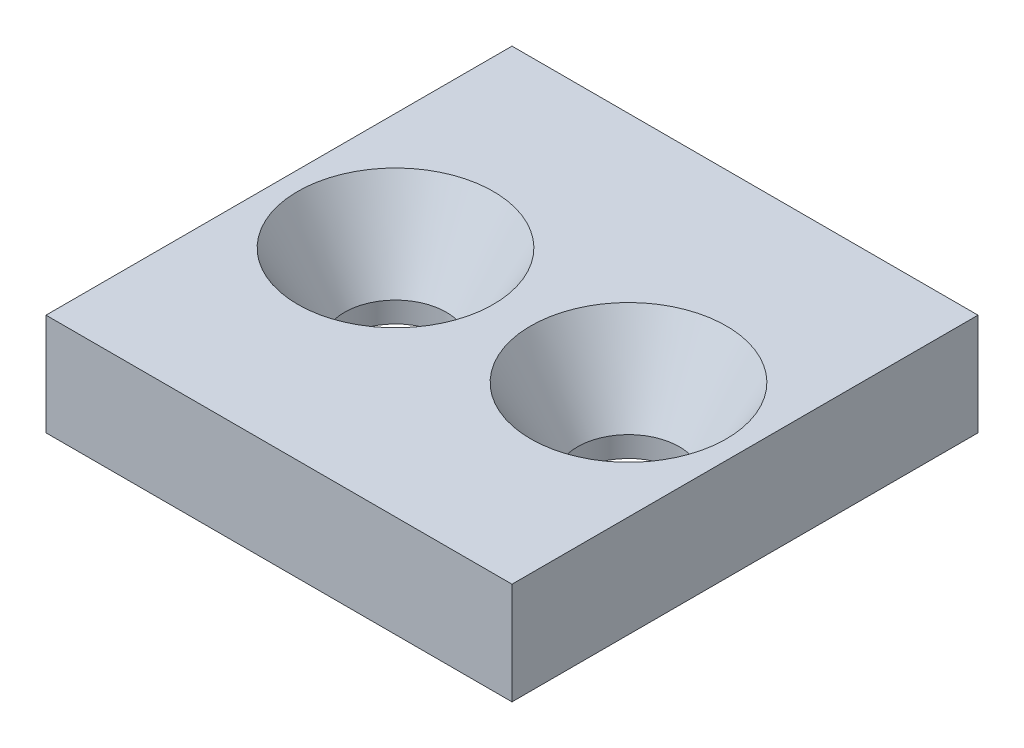
ISO-10303-21;
HEADER;
FILE_DESCRIPTION(('STEP AP214'),'2;1');
FILE_NAME('part.step','',(''),(''),'','','');
FILE_SCHEMA(('AUTOMOTIVE_DESIGN { 1 0 10303 214 1 1 1 1 }'));
ENDSEC;
DATA;
#1=APPLICATION_CONTEXT('core data for automotive mechanical design processes');
#2=APPLICATION_PROTOCOL_DEFINITION('international standard','automotive_design',2000,#1);
#3=PRODUCT_CONTEXT('',#1,'mechanical');
#4=PRODUCT('Part','Part','',(#3));
#5=PRODUCT_RELATED_PRODUCT_CATEGORY('part','',(#4));
#6=PRODUCT_DEFINITION_FORMATION('','',#4);
#7=PRODUCT_DEFINITION_CONTEXT('part definition',#1,'design');
#8=PRODUCT_DEFINITION('design','',#6,#7);
#9=PRODUCT_DEFINITION_SHAPE('','',#8);
#10=(LENGTH_UNIT() NAMED_UNIT(*) SI_UNIT(.MILLI.,.METRE.));
#11=(NAMED_UNIT(*) PLANE_ANGLE_UNIT() SI_UNIT($,.RADIAN.));
#12=(NAMED_UNIT(*) SI_UNIT($,.STERADIAN.) SOLID_ANGLE_UNIT());
#13=UNCERTAINTY_MEASURE_WITH_UNIT(LENGTH_MEASURE(1.E-05),#10,'distance_accuracy_value','');
#14=(GEOMETRIC_REPRESENTATION_CONTEXT(3) GLOBAL_UNCERTAINTY_ASSIGNED_CONTEXT((#13)) GLOBAL_UNIT_ASSIGNED_CONTEXT((#10,
#11,#12)) REPRESENTATION_CONTEXT('',''));
#15=CARTESIAN_POINT('',(0.,0.,0.));
#16=DIRECTION('',(0.,0.,1.));
#17=DIRECTION('',(1.,0.,0.));
#18=AXIS2_PLACEMENT_3D('',#15,#16,#17);
#19=CARTESIAN_POINT('',(0.,0.,0.));
#20=DIRECTION('',(0.,-1.,0.));
#21=DIRECTION('',(0.,0.,-1.));
#22=AXIS2_PLACEMENT_3D('',#19,#20,#21);
#23=PLANE('',#22);
#24=CARTESIAN_POINT('',(8.,0.,-16.));
#25=DIRECTION('',(0.,1.,0.));
#26=DIRECTION('',(0.,0.,1.));
#27=AXIS2_PLACEMENT_3D('',#24,#25,#26);
#28=CIRCLE('',#27,3.5);
#29=CARTESIAN_POINT('',(8.,0.,-12.5));
#30=VERTEX_POINT('',#29);
#31=EDGE_CURVE('E123',#30,#30,#28,.T.);
#32=ORIENTED_EDGE('',*,*,#31,.T.);
#33=EDGE_LOOP('',(#32));
#34=FACE_BOUND('',#33,.T.);
#35=DIRECTION('',(1.,0.,0.));
#36=VECTOR('',#35,1.);
#37=CARTESIAN_POINT('',(0.,0.,0.));
#38=LINE('',#37,#36);
#39=CARTESIAN_POINT('',(0.,0.,0.));
#40=VERTEX_POINT('',#39);
#41=CARTESIAN_POINT('',(32.,0.,0.));
#42=VERTEX_POINT('',#41);
#43=EDGE_CURVE('E101',#40,#42,#38,.T.);
#44=ORIENTED_EDGE('',*,*,#43,.F.);
#45=DIRECTION('',(0.,0.,1.));
#46=VECTOR('',#45,1.);
#47=CARTESIAN_POINT('',(0.,0.,0.));
#48=LINE('',#47,#46);
#49=CARTESIAN_POINT('',(0.,0.,-32.));
#50=VERTEX_POINT('',#49);
#51=EDGE_CURVE('E77',#50,#40,#48,.T.);
#52=ORIENTED_EDGE('',*,*,#51,.F.);
#53=DIRECTION('',(-1.,0.,0.));
#54=VECTOR('',#53,1.);
#55=CARTESIAN_POINT('',(0.,0.,-32.));
#56=LINE('',#55,#54);
#57=CARTESIAN_POINT('',(32.,0.,-32.));
#58=VERTEX_POINT('',#57);
#59=EDGE_CURVE('E71',#58,#50,#56,.T.);
#60=ORIENTED_EDGE('',*,*,#59,.F.);
#61=DIRECTION('',(0.,0.,-1.));
#62=VECTOR('',#61,1.);
#63=CARTESIAN_POINT('',(32.,0.,-32.));
#64=LINE('',#63,#62);
#65=EDGE_CURVE('E93',#42,#58,#64,.T.);
#66=ORIENTED_EDGE('',*,*,#65,.F.);
#67=EDGE_LOOP('',(#44,#52,#60,#66));
#68=FACE_BOUND('',#67,.T.);
#69=CARTESIAN_POINT('',(24.,0.,-16.));
#70=DIRECTION('',(0.,1.,0.));
#71=DIRECTION('',(0.,0.,1.));
#72=AXIS2_PLACEMENT_3D('',#69,#70,#71);
#73=CIRCLE('',#72,3.5);
#74=CARTESIAN_POINT('',(24.,0.,-12.5));
#75=VERTEX_POINT('',#74);
#76=EDGE_CURVE('E104',#75,#75,#73,.T.);
#77=ORIENTED_EDGE('',*,*,#76,.T.);
#78=EDGE_LOOP('',(#77));
#79=FACE_BOUND('',#78,.T.);
#80=ADVANCED_FACE('F37',(#34,#68,#79),#23,.T.);
#81=CARTESIAN_POINT('',(0.,7.,0.));
#82=DIRECTION('',(0.,0.,-1.));
#83=DIRECTION('',(-1.,0.,0.));
#84=AXIS2_PLACEMENT_3D('',#81,#82,#83);
#85=PLANE('',#84);
#86=ORIENTED_EDGE('',*,*,#43,.T.);
#87=DIRECTION('',(0.,-1.,0.));
#88=VECTOR('',#87,1.);
#89=CARTESIAN_POINT('',(32.,7.,0.));
#90=LINE('',#89,#88);
#91=CARTESIAN_POINT('',(32.,7.,0.));
#92=VERTEX_POINT('',#91);
#93=EDGE_CURVE('E11',#92,#42,#90,.T.);
#94=ORIENTED_EDGE('',*,*,#93,.F.);
#95=DIRECTION('',(1.,0.,0.));
#96=VECTOR('',#95,1.);
#97=CARTESIAN_POINT('',(0.,7.,0.));
#98=LINE('',#97,#96);
#99=CARTESIAN_POINT('',(0.,7.,0.));
#100=VERTEX_POINT('',#99);
#101=EDGE_CURVE('E89',#100,#92,#98,.T.);
#102=ORIENTED_EDGE('',*,*,#101,.F.);
#103=DIRECTION('',(0.,-1.,0.));
#104=VECTOR('',#103,1.);
#105=CARTESIAN_POINT('',(0.,7.,0.));
#106=LINE('',#105,#104);
#107=EDGE_CURVE('E97',#100,#40,#106,.T.);
#108=ORIENTED_EDGE('',*,*,#107,.T.);
#109=EDGE_LOOP('',(#86,#94,#102,#108));
#110=FACE_BOUND('',#109,.T.);
#111=ADVANCED_FACE('F39',(#110),#85,.F.);
#112=CARTESIAN_POINT('',(32.,7.,-32.));
#113=DIRECTION('',(-1.,0.,0.));
#114=DIRECTION('',(0.,0.,1.));
#115=AXIS2_PLACEMENT_3D('',#112,#113,#114);
#116=PLANE('',#115);
#117=ORIENTED_EDGE('',*,*,#65,.T.);
#118=DIRECTION('',(0.,-1.,0.));
#119=VECTOR('',#118,1.);
#120=CARTESIAN_POINT('',(32.,7.,-32.));
#121=LINE('',#120,#119);
#122=CARTESIAN_POINT('',(32.,7.,-32.));
#123=VERTEX_POINT('',#122);
#124=EDGE_CURVE('E46',#123,#58,#121,.T.);
#125=ORIENTED_EDGE('',*,*,#124,.F.);
#126=DIRECTION('',(0.,0.,-1.));
#127=VECTOR('',#126,1.);
#128=CARTESIAN_POINT('',(32.,7.,-32.));
#129=LINE('',#128,#127);
#130=EDGE_CURVE('E84',#92,#123,#129,.T.);
#131=ORIENTED_EDGE('',*,*,#130,.F.);
#132=ORIENTED_EDGE('',*,*,#93,.T.);
#133=EDGE_LOOP('',(#117,#125,#131,#132));
#134=FACE_BOUND('',#133,.T.);
#135=ADVANCED_FACE('F92',(#134),#116,.F.);
#136=CARTESIAN_POINT('',(0.,7.,-32.));
#137=DIRECTION('',(0.,0.,1.));
#138=DIRECTION('',(1.,0.,0.));
#139=AXIS2_PLACEMENT_3D('',#136,#137,#138);
#140=PLANE('',#139);
#141=ORIENTED_EDGE('',*,*,#59,.T.);
#142=DIRECTION('',(0.,-1.,0.));
#143=VECTOR('',#142,1.);
#144=CARTESIAN_POINT('',(0.,7.,-32.));
#145=LINE('',#144,#143);
#146=CARTESIAN_POINT('',(0.,7.,-32.));
#147=VERTEX_POINT('',#146);
#148=EDGE_CURVE('E94',#147,#50,#145,.T.);
#149=ORIENTED_EDGE('',*,*,#148,.F.);
#150=DIRECTION('',(-1.,0.,0.));
#151=VECTOR('',#150,1.);
#152=CARTESIAN_POINT('',(0.,7.,-32.));
#153=LINE('',#152,#151);
#154=EDGE_CURVE('E87',#123,#147,#153,.T.);
#155=ORIENTED_EDGE('',*,*,#154,.F.);
#156=ORIENTED_EDGE('',*,*,#124,.T.);
#157=EDGE_LOOP('',(#141,#149,#155,#156));
#158=FACE_BOUND('',#157,.T.);
#159=ADVANCED_FACE('F95',(#158),#140,.F.);
#160=CARTESIAN_POINT('',(0.,7.,0.));
#161=DIRECTION('',(1.,0.,0.));
#162=DIRECTION('',(0.,0.,-1.));
#163=AXIS2_PLACEMENT_3D('',#160,#161,#162);
#164=PLANE('',#163);
#165=ORIENTED_EDGE('',*,*,#51,.T.);
#166=ORIENTED_EDGE('',*,*,#107,.F.);
#167=DIRECTION('',(0.,0.,1.));
#168=VECTOR('',#167,1.);
#169=CARTESIAN_POINT('',(0.,7.,0.));
#170=LINE('',#169,#168);
#171=EDGE_CURVE('E54',#147,#100,#170,.T.);
#172=ORIENTED_EDGE('',*,*,#171,.F.);
#173=ORIENTED_EDGE('',*,*,#148,.T.);
#174=EDGE_LOOP('',(#165,#166,#172,#173));
#175=FACE_BOUND('',#174,.T.);
#176=ADVANCED_FACE('F109',(#175),#164,.F.);
#177=CARTESIAN_POINT('',(0.,7.,0.));
#178=DIRECTION('',(0.,-1.,0.));
#179=DIRECTION('',(0.,0.,-1.));
#180=AXIS2_PLACEMENT_3D('',#177,#178,#179);
#181=PLANE('',#180);
#182=CARTESIAN_POINT('',(8.,7.,-16.));
#183=DIRECTION('',(0.,1.,0.));
#184=DIRECTION('',(0.,0.,1.));
#185=AXIS2_PLACEMENT_3D('',#182,#183,#184);
#186=CIRCLE('',#185,6.72);
#187=CARTESIAN_POINT('',(8.,7.,-9.28));
#188=VERTEX_POINT('',#187);
#189=EDGE_CURVE('E129',#188,#188,#186,.T.);
#190=ORIENTED_EDGE('',*,*,#189,.F.);
#191=EDGE_LOOP('',(#190));
#192=FACE_BOUND('',#191,.T.);
#193=CARTESIAN_POINT('',(24.,7.,-16.));
#194=DIRECTION('',(0.,1.,0.));
#195=DIRECTION('',(0.,0.,1.));
#196=AXIS2_PLACEMENT_3D('',#193,#194,#195);
#197=CIRCLE('',#196,6.72);
#198=CARTESIAN_POINT('',(24.,7.,-9.28));
#199=VERTEX_POINT('',#198);
#200=EDGE_CURVE('E120',#199,#199,#197,.T.);
#201=ORIENTED_EDGE('',*,*,#200,.F.);
#202=EDGE_LOOP('',(#201));
#203=FACE_BOUND('',#202,.T.);
#204=ORIENTED_EDGE('',*,*,#101,.T.);
#205=ORIENTED_EDGE('',*,*,#130,.T.);
#206=ORIENTED_EDGE('',*,*,#154,.T.);
#207=ORIENTED_EDGE('',*,*,#171,.T.);
#208=EDGE_LOOP('',(#204,#205,#206,#207));
#209=FACE_BOUND('',#208,.T.);
#210=ADVANCED_FACE('F85',(#192,#203,#209),#181,.F.);
#211=CARTESIAN_POINT('',(24.,7.,-16.));
#212=DIRECTION('',(0.,1.,0.));
#213=DIRECTION('',(0.,0.,1.));
#214=AXIS2_PLACEMENT_3D('',#211,#212,#213);
#215=CYLINDRICAL_SURFACE('',#214,3.5);
#216=ORIENTED_EDGE('',*,*,#76,.F.);
#217=EDGE_LOOP('',(#216));
#218=FACE_BOUND('',#217,.T.);
#219=CARTESIAN_POINT('',(24.,1.42279639962821,-16.));
#220=DIRECTION('',(0.,1.,0.));
#221=DIRECTION('',(0.,0.,1.));
#222=AXIS2_PLACEMENT_3D('',#219,#220,#221);
#223=CIRCLE('',#222,3.5);
#224=CARTESIAN_POINT('',(24.,1.42279639962821,-12.5));
#225=VERTEX_POINT('',#224);
#226=EDGE_CURVE('E117',#225,#225,#223,.T.);
#227=ORIENTED_EDGE('',*,*,#226,.T.);
#228=EDGE_LOOP('',(#227));
#229=FACE_BOUND('',#228,.T.);
#230=ADVANCED_FACE('F137',(#218,#229),#215,.F.);
#231=CARTESIAN_POINT('',(24.,7.,-16.));
#232=DIRECTION('',(0.,1.,0.));
#233=DIRECTION('',(0.,0.,1.));
#234=AXIS2_PLACEMENT_3D('',#231,#232,#233);
#235=CONICAL_SURFACE('',#234,6.72,0.523598775598299);
#236=ORIENTED_EDGE('',*,*,#226,.F.);
#237=EDGE_LOOP('',(#236));
#238=FACE_BOUND('',#237,.T.);
#239=ORIENTED_EDGE('',*,*,#200,.T.);
#240=EDGE_LOOP('',(#239));
#241=FACE_BOUND('',#240,.T.);
#242=ADVANCED_FACE('F141',(#238,#241),#235,.F.);
#243=CARTESIAN_POINT('',(8.,7.,-16.));
#244=DIRECTION('',(0.,1.,0.));
#245=DIRECTION('',(0.,0.,1.));
#246=AXIS2_PLACEMENT_3D('',#243,#244,#245);
#247=CYLINDRICAL_SURFACE('',#246,3.5);
#248=ORIENTED_EDGE('',*,*,#31,.F.);
#249=EDGE_LOOP('',(#248));
#250=FACE_BOUND('',#249,.T.);
#251=CARTESIAN_POINT('',(8.,1.42279639962821,-16.));
#252=DIRECTION('',(0.,1.,0.));
#253=DIRECTION('',(0.,0.,1.));
#254=AXIS2_PLACEMENT_3D('',#251,#252,#253);
#255=CIRCLE('',#254,3.5);
#256=CARTESIAN_POINT('',(8.,1.42279639962821,-12.5));
#257=VERTEX_POINT('',#256);
#258=EDGE_CURVE('E126',#257,#257,#255,.T.);
#259=ORIENTED_EDGE('',*,*,#258,.T.);
#260=EDGE_LOOP('',(#259));
#261=FACE_BOUND('',#260,.T.);
#262=ADVANCED_FACE('F143',(#250,#261),#247,.F.);
#263=CARTESIAN_POINT('',(8.,7.,-16.));
#264=DIRECTION('',(0.,1.,0.));
#265=DIRECTION('',(0.,0.,1.));
#266=AXIS2_PLACEMENT_3D('',#263,#264,#265);
#267=CONICAL_SURFACE('',#266,6.72,0.523598775598299);
#268=ORIENTED_EDGE('',*,*,#258,.F.);
#269=EDGE_LOOP('',(#268));
#270=FACE_BOUND('',#269,.T.);
#271=ORIENTED_EDGE('',*,*,#189,.T.);
#272=EDGE_LOOP('',(#271));
#273=FACE_BOUND('',#272,.T.);
#274=ADVANCED_FACE('F133',(#270,#273),#267,.F.);
#275=CLOSED_SHELL('',(#80,#111,#135,#159,#176,#210,#230,#242,#262,#274));
#276=MANIFOLD_SOLID_BREP('B2',#275);
#277=ADVANCED_BREP_SHAPE_REPRESENTATION('',(#18,#276),#14);
#278=SHAPE_DEFINITION_REPRESENTATION(#9,#277);
ENDSEC;
END-ISO-10303-21;
